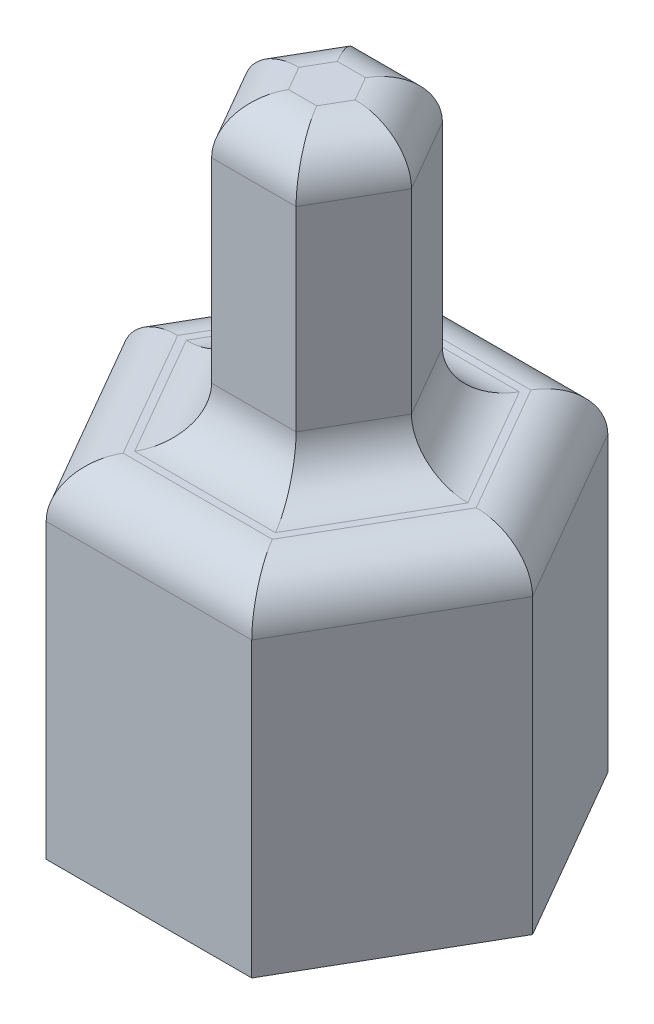
ISO-10303-21;
HEADER;
FILE_DESCRIPTION(('STEP AP214'),'2;1');
FILE_NAME('part.step','',(''),(''),'','','');
FILE_SCHEMA(('AUTOMOTIVE_DESIGN { 1 0 10303 214 1 1 1 1 }'));
ENDSEC;
DATA;
#1=APPLICATION_CONTEXT('core data for automotive mechanical design processes');
#2=APPLICATION_PROTOCOL_DEFINITION('international standard','automotive_design',2000,#1);
#3=PRODUCT_CONTEXT('',#1,'mechanical');
#4=PRODUCT('Part','Part','',(#3));
#5=PRODUCT_RELATED_PRODUCT_CATEGORY('part','',(#4));
#6=PRODUCT_DEFINITION_FORMATION('','',#4);
#7=PRODUCT_DEFINITION_CONTEXT('part definition',#1,'design');
#8=PRODUCT_DEFINITION('design','',#6,#7);
#9=PRODUCT_DEFINITION_SHAPE('','',#8);
#10=(LENGTH_UNIT() NAMED_UNIT(*) SI_UNIT(.MILLI.,.METRE.));
#11=(NAMED_UNIT(*) PLANE_ANGLE_UNIT() SI_UNIT($,.RADIAN.));
#12=(NAMED_UNIT(*) SI_UNIT($,.STERADIAN.) SOLID_ANGLE_UNIT());
#13=UNCERTAINTY_MEASURE_WITH_UNIT(LENGTH_MEASURE(1.E-05),#10,'distance_accuracy_value','');
#14=(GEOMETRIC_REPRESENTATION_CONTEXT(3) GLOBAL_UNCERTAINTY_ASSIGNED_CONTEXT((#13)) GLOBAL_UNIT_ASSIGNED_CONTEXT((#10,
#11,#12)) REPRESENTATION_CONTEXT('',''));
#15=CARTESIAN_POINT('',(0.,0.,0.));
#16=DIRECTION('',(0.,0.,1.));
#17=DIRECTION('',(1.,0.,0.));
#18=AXIS2_PLACEMENT_3D('',#15,#16,#17);
#19=CARTESIAN_POINT('',(0.,0.,0.));
#20=DIRECTION('',(0.,1.,0.));
#21=DIRECTION('',(0.,0.,1.));
#22=AXIS2_PLACEMENT_3D('',#19,#20,#21);
#23=PLANE('',#22);
#24=DIRECTION('',(0.5,0.,-0.866025403784439));
#25=VECTOR('',#24,1.);
#26=CARTESIAN_POINT('',(5.35261434565702,0.,9.271));
#27=LINE('',#26,#25);
#28=CARTESIAN_POINT('',(5.35261434565702,0.,9.271));
#29=VERTEX_POINT('',#28);
#30=CARTESIAN_POINT('',(10.705228691314,0.,0.));
#31=VERTEX_POINT('',#30);
#32=EDGE_CURVE('E249',#29,#31,#27,.T.);
#33=ORIENTED_EDGE('',*,*,#32,.F.);
#34=DIRECTION('',(1.,0.,0.));
#35=VECTOR('',#34,1.);
#36=CARTESIAN_POINT('',(-5.35261434565702,0.,9.271));
#37=LINE('',#36,#35);
#38=CARTESIAN_POINT('',(-5.35261434565702,0.,9.271));
#39=VERTEX_POINT('',#38);
#40=EDGE_CURVE('E264',#39,#29,#37,.T.);
#41=ORIENTED_EDGE('',*,*,#40,.F.);
#42=DIRECTION('',(0.5,0.,0.866025403784438));
#43=VECTOR('',#42,1.);
#44=CARTESIAN_POINT('',(-10.705228691314,0.,0.));
#45=LINE('',#44,#43);
#46=CARTESIAN_POINT('',(-10.705228691314,0.,0.));
#47=VERTEX_POINT('',#46);
#48=EDGE_CURVE('E261',#47,#39,#45,.T.);
#49=ORIENTED_EDGE('',*,*,#48,.F.);
#50=DIRECTION('',(-0.5,0.,0.866025403784439));
#51=VECTOR('',#50,1.);
#52=CARTESIAN_POINT('',(-5.35261434565702,0.,-9.271));
#53=LINE('',#52,#51);
#54=CARTESIAN_POINT('',(-5.35261434565702,0.,-9.271));
#55=VERTEX_POINT('',#54);
#56=EDGE_CURVE('E258',#55,#47,#53,.T.);
#57=ORIENTED_EDGE('',*,*,#56,.F.);
#58=DIRECTION('',(-1.,0.,0.));
#59=VECTOR('',#58,1.);
#60=CARTESIAN_POINT('',(5.35261434565702,0.,-9.271));
#61=LINE('',#60,#59);
#62=CARTESIAN_POINT('',(5.35261434565702,0.,-9.271));
#63=VERTEX_POINT('',#62);
#64=EDGE_CURVE('E255',#63,#55,#61,.T.);
#65=ORIENTED_EDGE('',*,*,#64,.F.);
#66=DIRECTION('',(-0.5,0.,-0.866025403784438));
#67=VECTOR('',#66,1.);
#68=CARTESIAN_POINT('',(10.705228691314,0.,0.));
#69=LINE('',#68,#67);
#70=EDGE_CURVE('E252',#31,#63,#69,.T.);
#71=ORIENTED_EDGE('',*,*,#70,.F.);
#72=EDGE_LOOP('',(#33,#41,#49,#57,#65,#71));
#73=FACE_BOUND('',#72,.T.);
#74=DIRECTION('',(-1.,0.,0.));
#75=VECTOR('',#74,1.);
#76=CARTESIAN_POINT('',(3.88614466191537,0.,-6.731));
#77=LINE('',#76,#75);
#78=CARTESIAN_POINT('',(3.88614466191537,0.,-6.731));
#79=VERTEX_POINT('',#78);
#80=CARTESIAN_POINT('',(-3.88614466191537,0.,-6.731));
#81=VERTEX_POINT('',#80);
#82=EDGE_CURVE('E633',#79,#81,#77,.T.);
#83=ORIENTED_EDGE('',*,*,#82,.T.);
#84=CARTESIAN_POINT('',(-7.77228932383074,0.,0.));
#85=CARTESIAN_POINT('',(-7.58898061336304,0.,-4.3815));
#86=CARTESIAN_POINT('',(-3.88614466191537,0.,-6.731));
#87=B_SPLINE_CURVE_WITH_KNOTS('',2,(#84,#85,#86),.UNSPECIFIED.,.F.,.F.,(3,3),(0.,1.),.UNSPECIFIED.);
#88=CARTESIAN_POINT('',(-7.77228932383074,0.,0.));
#89=VERTEX_POINT('',#88);
#90=EDGE_CURVE('E222',#89,#81,#87,.T.);
#91=ORIENTED_EDGE('',*,*,#90,.F.);
#92=DIRECTION('',(0.5,0.,0.866025403784438));
#93=VECTOR('',#92,1.);
#94=CARTESIAN_POINT('',(-7.77228932383074,0.,0.));
#95=LINE('',#94,#93);
#96=CARTESIAN_POINT('',(-3.88614466191537,0.,6.731));
#97=VERTEX_POINT('',#96);
#98=EDGE_CURVE('E237',#89,#97,#95,.T.);
#99=ORIENTED_EDGE('',*,*,#98,.T.);
#100=DIRECTION('',(1.,0.,0.));
#101=VECTOR('',#100,1.);
#102=CARTESIAN_POINT('',(-3.88614466191537,0.,6.731));
#103=LINE('',#102,#101);
#104=CARTESIAN_POINT('',(3.88614466191537,0.,6.731));
#105=VERTEX_POINT('',#104);
#106=EDGE_CURVE('E628',#97,#105,#103,.T.);
#107=ORIENTED_EDGE('',*,*,#106,.T.);
#108=CARTESIAN_POINT('',(7.77228932383074,0.,0.));
#109=CARTESIAN_POINT('',(7.58898061336304,0.,4.3815));
#110=CARTESIAN_POINT('',(3.88614466191537,0.,6.731));
#111=B_SPLINE_CURVE_WITH_KNOTS('',2,(#108,#109,#110),.UNSPECIFIED.,.F.,.F.,(3,3),(0.,1.),.UNSPECIFIED.);
#112=CARTESIAN_POINT('',(7.77228932383074,0.,0.));
#113=VERTEX_POINT('',#112);
#114=EDGE_CURVE('E349',#113,#105,#111,.T.);
#115=ORIENTED_EDGE('',*,*,#114,.F.);
#116=DIRECTION('',(-0.5,0.,-0.866025403784438));
#117=VECTOR('',#116,1.);
#118=CARTESIAN_POINT('',(7.77228932383074,0.,0.));
#119=LINE('',#118,#117);
#120=EDGE_CURVE('E624',#113,#79,#119,.T.);
#121=ORIENTED_EDGE('',*,*,#120,.T.);
#122=EDGE_LOOP('',(#83,#91,#99,#107,#115,#121));
#123=FACE_BOUND('',#122,.T.);
#124=ADVANCED_FACE('F32',(#73,#123),#23,.F.);
#125=CARTESIAN_POINT('',(5.35261434565702,15.24,9.271));
#126=DIRECTION('',(-0.866025403784439,0.,-0.5));
#127=DIRECTION('',(-0.5,0.,0.866025403784439));
#128=AXIS2_PLACEMENT_3D('',#125,#126,#127);
#129=PLANE('',#128);
#130=DIRECTION('',(0.,-1.,0.));
#131=VECTOR('',#130,1.);
#132=CARTESIAN_POINT('',(10.705228691314,15.24,0.));
#133=LINE('',#132,#131);
#134=CARTESIAN_POINT('',(10.705228691314,15.24,0.));
#135=VERTEX_POINT('',#134);
#136=EDGE_CURVE('E277',#135,#31,#133,.T.);
#137=ORIENTED_EDGE('',*,*,#136,.F.);
#138=DIRECTION('',(0.5,0.,-0.866025403784439));
#139=VECTOR('',#138,1.);
#140=CARTESIAN_POINT('',(5.35261434565702,15.24,9.271));
#141=LINE('',#140,#139);
#142=CARTESIAN_POINT('',(5.35261434565702,15.24,9.271));
#143=VERTEX_POINT('',#142);
#144=EDGE_CURVE('E11',#135,#143,#141,.F.);
#145=ORIENTED_EDGE('',*,*,#144,.T.);
#146=DIRECTION('',(0.,-1.,0.));
#147=VECTOR('',#146,1.);
#148=CARTESIAN_POINT('',(5.35261434565702,15.24,9.271));
#149=LINE('',#148,#147);
#150=EDGE_CURVE('E267',#143,#29,#149,.T.);
#151=ORIENTED_EDGE('',*,*,#150,.T.);
#152=ORIENTED_EDGE('',*,*,#32,.T.);
#153=EDGE_LOOP('',(#137,#145,#151,#152));
#154=FACE_BOUND('',#153,.T.);
#155=ADVANCED_FACE('F484',(#154),#129,.F.);
#156=CARTESIAN_POINT('',(10.705228691314,15.24,0.));
#157=DIRECTION('',(-0.866025403784438,0.,0.5));
#158=DIRECTION('',(0.5,0.,0.866025403784438));
#159=AXIS2_PLACEMENT_3D('',#156,#157,#158);
#160=PLANE('',#159);
#161=DIRECTION('',(0.,-1.,0.));
#162=VECTOR('',#161,1.);
#163=CARTESIAN_POINT('',(5.35261434565702,15.24,-9.271));
#164=LINE('',#163,#162);
#165=CARTESIAN_POINT('',(5.35261434565702,15.24,-9.271));
#166=VERTEX_POINT('',#165);
#167=EDGE_CURVE('E275',#166,#63,#164,.T.);
#168=ORIENTED_EDGE('',*,*,#167,.F.);
#169=DIRECTION('',(-0.5,0.,-0.866025403784438));
#170=VECTOR('',#169,1.);
#171=CARTESIAN_POINT('',(10.705228691314,15.24,0.));
#172=LINE('',#171,#170);
#173=EDGE_CURVE('E41',#166,#135,#172,.F.);
#174=ORIENTED_EDGE('',*,*,#173,.T.);
#175=ORIENTED_EDGE('',*,*,#136,.T.);
#176=ORIENTED_EDGE('',*,*,#70,.T.);
#177=EDGE_LOOP('',(#168,#174,#175,#176));
#178=FACE_BOUND('',#177,.T.);
#179=ADVANCED_FACE('F500',(#178),#160,.F.);
#180=CARTESIAN_POINT('',(5.35261434565702,15.24,-9.271));
#181=DIRECTION('',(0.,0.,1.));
#182=DIRECTION('',(1.,0.,0.));
#183=AXIS2_PLACEMENT_3D('',#180,#181,#182);
#184=PLANE('',#183);
#185=DIRECTION('',(0.,-1.,0.));
#186=VECTOR('',#185,1.);
#187=CARTESIAN_POINT('',(-5.35261434565702,15.24,-9.271));
#188=LINE('',#187,#186);
#189=CARTESIAN_POINT('',(-5.35261434565702,15.24,-9.271));
#190=VERTEX_POINT('',#189);
#191=EDGE_CURVE('E273',#190,#55,#188,.T.);
#192=ORIENTED_EDGE('',*,*,#191,.F.);
#193=DIRECTION('',(-1.,0.,0.));
#194=VECTOR('',#193,1.);
#195=CARTESIAN_POINT('',(5.35261434565702,15.24,-9.271));
#196=LINE('',#195,#194);
#197=EDGE_CURVE('E56',#190,#166,#196,.F.);
#198=ORIENTED_EDGE('',*,*,#197,.T.);
#199=ORIENTED_EDGE('',*,*,#167,.T.);
#200=ORIENTED_EDGE('',*,*,#64,.T.);
#201=EDGE_LOOP('',(#192,#198,#199,#200));
#202=FACE_BOUND('',#201,.T.);
#203=ADVANCED_FACE('F496',(#202),#184,.F.);
#204=CARTESIAN_POINT('',(-5.35261434565702,15.24,-9.271));
#205=DIRECTION('',(0.866025403784439,0.,0.5));
#206=DIRECTION('',(0.5,0.,-0.866025403784439));
#207=AXIS2_PLACEMENT_3D('',#204,#205,#206);
#208=PLANE('',#207);
#209=DIRECTION('',(0.,-1.,0.));
#210=VECTOR('',#209,1.);
#211=CARTESIAN_POINT('',(-10.705228691314,15.24,0.));
#212=LINE('',#211,#210);
#213=CARTESIAN_POINT('',(-10.705228691314,15.24,0.));
#214=VERTEX_POINT('',#213);
#215=EDGE_CURVE('E271',#214,#47,#212,.T.);
#216=ORIENTED_EDGE('',*,*,#215,.F.);
#217=DIRECTION('',(-0.5,0.,0.866025403784439));
#218=VECTOR('',#217,1.);
#219=CARTESIAN_POINT('',(-5.35261434565702,15.24,-9.271));
#220=LINE('',#219,#218);
#221=EDGE_CURVE('E381',#214,#190,#220,.F.);
#222=ORIENTED_EDGE('',*,*,#221,.T.);
#223=ORIENTED_EDGE('',*,*,#191,.T.);
#224=ORIENTED_EDGE('',*,*,#56,.T.);
#225=EDGE_LOOP('',(#216,#222,#223,#224));
#226=FACE_BOUND('',#225,.T.);
#227=ADVANCED_FACE('F492',(#226),#208,.F.);
#228=CARTESIAN_POINT('',(-10.705228691314,15.24,0.));
#229=DIRECTION('',(0.866025403784438,0.,-0.5));
#230=DIRECTION('',(-0.5,0.,-0.866025403784439));
#231=AXIS2_PLACEMENT_3D('',#228,#229,#230);
#232=PLANE('',#231);
#233=DIRECTION('',(0.,-1.,0.));
#234=VECTOR('',#233,1.);
#235=CARTESIAN_POINT('',(-5.35261434565702,15.24,9.271));
#236=LINE('',#235,#234);
#237=CARTESIAN_POINT('',(-5.35261434565702,15.24,9.271));
#238=VERTEX_POINT('',#237);
#239=EDGE_CURVE('E269',#238,#39,#236,.T.);
#240=ORIENTED_EDGE('',*,*,#239,.F.);
#241=DIRECTION('',(0.5,0.,0.866025403784439));
#242=VECTOR('',#241,1.);
#243=CARTESIAN_POINT('',(-10.705228691314,15.24,0.));
#244=LINE('',#243,#242);
#245=EDGE_CURVE('E379',#238,#214,#244,.F.);
#246=ORIENTED_EDGE('',*,*,#245,.T.);
#247=ORIENTED_EDGE('',*,*,#215,.T.);
#248=ORIENTED_EDGE('',*,*,#48,.T.);
#249=EDGE_LOOP('',(#240,#246,#247,#248));
#250=FACE_BOUND('',#249,.T.);
#251=ADVANCED_FACE('F488',(#250),#232,.F.);
#252=CARTESIAN_POINT('',(-5.35261434565702,15.24,9.271));
#253=DIRECTION('',(0.,0.,-1.));
#254=DIRECTION('',(-1.,0.,0.));
#255=AXIS2_PLACEMENT_3D('',#252,#253,#254);
#256=PLANE('',#255);
#257=ORIENTED_EDGE('',*,*,#150,.F.);
#258=DIRECTION('',(1.,0.,0.));
#259=VECTOR('',#258,1.);
#260=CARTESIAN_POINT('',(-5.35261434565702,15.24,9.271));
#261=LINE('',#260,#259);
#262=EDGE_CURVE('E376',#143,#238,#261,.F.);
#263=ORIENTED_EDGE('',*,*,#262,.T.);
#264=ORIENTED_EDGE('',*,*,#239,.T.);
#265=ORIENTED_EDGE('',*,*,#40,.T.);
#266=EDGE_LOOP('',(#257,#263,#264,#265));
#267=FACE_BOUND('',#266,.T.);
#268=ADVANCED_FACE('F480',(#267),#256,.F.);
#269=CARTESIAN_POINT('',(7.77228932383074,15.24,0.));
#270=DIRECTION('',(-0.866025403784438,0.,0.5));
#271=DIRECTION('',(0.5,0.,0.866025403784438));
#272=AXIS2_PLACEMENT_3D('',#269,#270,#271);
#273=PLANE('',#272);
#274=ORIENTED_EDGE('',*,*,#120,.F.);
#275=DIRECTION('',(0.,-1.,0.));
#276=VECTOR('',#275,1.);
#277=CARTESIAN_POINT('',(7.77228932383074,15.24,0.));
#278=LINE('',#277,#276);
#279=CARTESIAN_POINT('',(7.77228932383074,15.24,0.));
#280=VERTEX_POINT('',#279);
#281=EDGE_CURVE('E247',#280,#113,#278,.T.);
#282=ORIENTED_EDGE('',*,*,#281,.F.);
#283=DIRECTION('',(-0.5,0.,-0.866025403784438));
#284=VECTOR('',#283,1.);
#285=CARTESIAN_POINT('',(7.77228932383074,15.24,0.));
#286=LINE('',#285,#284);
#287=CARTESIAN_POINT('',(3.88614466191537,15.24,-6.731));
#288=VERTEX_POINT('',#287);
#289=EDGE_CURVE('E625',#280,#288,#286,.T.);
#290=ORIENTED_EDGE('',*,*,#289,.T.);
#291=DIRECTION('',(0.,-1.,0.));
#292=VECTOR('',#291,1.);
#293=CARTESIAN_POINT('',(3.88614466191537,15.24,-6.731));
#294=LINE('',#293,#292);
#295=EDGE_CURVE('E240',#288,#79,#294,.T.);
#296=ORIENTED_EDGE('',*,*,#295,.T.);
#297=EDGE_LOOP('',(#274,#282,#290,#296));
#298=FACE_BOUND('',#297,.T.);
#299=ADVANCED_FACE('F476',(#298),#273,.T.);
#300=CARTESIAN_POINT('',(3.88614466191537,15.24,-6.731));
#301=DIRECTION('',(0.,0.,1.));
#302=DIRECTION('',(1.,0.,0.));
#303=AXIS2_PLACEMENT_3D('',#300,#301,#302);
#304=PLANE('',#303);
#305=ORIENTED_EDGE('',*,*,#82,.F.);
#306=ORIENTED_EDGE('',*,*,#295,.F.);
#307=DIRECTION('',(-1.,0.,0.));
#308=VECTOR('',#307,1.);
#309=CARTESIAN_POINT('',(3.88614466191537,15.24,-6.731));
#310=LINE('',#309,#308);
#311=CARTESIAN_POINT('',(-3.88614466191537,15.24,-6.731));
#312=VERTEX_POINT('',#311);
#313=EDGE_CURVE('E232',#288,#312,#310,.T.);
#314=ORIENTED_EDGE('',*,*,#313,.T.);
#315=DIRECTION('',(0.,-1.,0.));
#316=VECTOR('',#315,1.);
#317=CARTESIAN_POINT('',(-3.88614466191537,15.24,-6.731));
#318=LINE('',#317,#316);
#319=EDGE_CURVE('E218',#312,#81,#318,.T.);
#320=ORIENTED_EDGE('',*,*,#319,.T.);
#321=EDGE_LOOP('',(#305,#306,#314,#320));
#322=FACE_BOUND('',#321,.T.);
#323=ADVANCED_FACE('F473',(#322),#304,.T.);
#324=CARTESIAN_POINT('',(-7.77228932383074,15.24,0.));
#325=DIRECTION('',(0.866025403784438,0.,-0.5));
#326=DIRECTION('',(-0.5,0.,-0.866025403784438));
#327=AXIS2_PLACEMENT_3D('',#324,#325,#326);
#328=PLANE('',#327);
#329=ORIENTED_EDGE('',*,*,#98,.F.);
#330=DIRECTION('',(0.,-1.,0.));
#331=VECTOR('',#330,1.);
#332=CARTESIAN_POINT('',(-7.77228932383074,15.24,0.));
#333=LINE('',#332,#331);
#334=CARTESIAN_POINT('',(-7.77228932383074,15.24,0.));
#335=VERTEX_POINT('',#334);
#336=EDGE_CURVE('E215',#335,#89,#333,.T.);
#337=ORIENTED_EDGE('',*,*,#336,.F.);
#338=DIRECTION('',(0.5,0.,0.866025403784438));
#339=VECTOR('',#338,1.);
#340=CARTESIAN_POINT('',(-7.77228932383074,15.24,0.));
#341=LINE('',#340,#339);
#342=CARTESIAN_POINT('',(-3.88614466191537,15.24,6.731));
#343=VERTEX_POINT('',#342);
#344=EDGE_CURVE('E225',#335,#343,#341,.T.);
#345=ORIENTED_EDGE('',*,*,#344,.T.);
#346=DIRECTION('',(0.,-1.,0.));
#347=VECTOR('',#346,1.);
#348=CARTESIAN_POINT('',(-3.88614466191537,15.24,6.731));
#349=LINE('',#348,#347);
#350=EDGE_CURVE('E238',#343,#97,#349,.T.);
#351=ORIENTED_EDGE('',*,*,#350,.T.);
#352=EDGE_LOOP('',(#329,#337,#345,#351));
#353=FACE_BOUND('',#352,.T.);
#354=ADVANCED_FACE('F235',(#353),#328,.T.);
#355=CARTESIAN_POINT('',(-3.88614466191537,15.24,6.731));
#356=DIRECTION('',(0.,0.,-1.));
#357=DIRECTION('',(-1.,0.,0.));
#358=AXIS2_PLACEMENT_3D('',#355,#356,#357);
#359=PLANE('',#358);
#360=ORIENTED_EDGE('',*,*,#106,.F.);
#361=ORIENTED_EDGE('',*,*,#350,.F.);
#362=DIRECTION('',(1.,0.,0.));
#363=VECTOR('',#362,1.);
#364=CARTESIAN_POINT('',(-3.88614466191537,15.24,6.731));
#365=LINE('',#364,#363);
#366=CARTESIAN_POINT('',(3.88614466191537,15.24,6.731));
#367=VERTEX_POINT('',#366);
#368=EDGE_CURVE('E229',#343,#367,#365,.T.);
#369=ORIENTED_EDGE('',*,*,#368,.T.);
#370=DIRECTION('',(0.,-1.,0.));
#371=VECTOR('',#370,1.);
#372=CARTESIAN_POINT('',(3.88614466191537,15.24,6.731));
#373=LINE('',#372,#371);
#374=EDGE_CURVE('E242',#367,#105,#373,.T.);
#375=ORIENTED_EDGE('',*,*,#374,.T.);
#376=EDGE_LOOP('',(#360,#361,#369,#375));
#377=FACE_BOUND('',#376,.T.);
#378=ADVANCED_FACE('F467',(#377),#359,.T.);
#379=CARTESIAN_POINT('',(0.,15.24,0.));
#380=DIRECTION('',(0.,1.,0.));
#381=DIRECTION('',(0.,0.,1.));
#382=AXIS2_PLACEMENT_3D('',#379,#380,#381);
#383=PLANE('',#382);
#384=ORIENTED_EDGE('',*,*,#289,.F.);
#385=CARTESIAN_POINT('',(7.77228932383074,15.24,0.));
#386=CARTESIAN_POINT('',(7.58898061336304,15.24,4.3815));
#387=CARTESIAN_POINT('',(3.88614466191537,15.24,6.731));
#388=B_SPLINE_CURVE_WITH_KNOTS('',2,(#385,#386,#387),.UNSPECIFIED.,.F.,.F.,(3,3),(0.,1.),.UNSPECIFIED.);
#389=EDGE_CURVE('E411',#280,#367,#388,.T.);
#390=ORIENTED_EDGE('',*,*,#389,.T.);
#391=ORIENTED_EDGE('',*,*,#368,.F.);
#392=ORIENTED_EDGE('',*,*,#344,.F.);
#393=CARTESIAN_POINT('',(-7.77228932383074,15.24,0.));
#394=CARTESIAN_POINT('',(-7.58898061336304,15.24,-4.3815));
#395=CARTESIAN_POINT('',(-3.88614466191537,15.24,-6.731));
#396=B_SPLINE_CURVE_WITH_KNOTS('',2,(#393,#394,#395),.UNSPECIFIED.,.F.,.F.,(3,3),(0.,1.),.UNSPECIFIED.);
#397=EDGE_CURVE('E211',#335,#312,#396,.T.);
#398=ORIENTED_EDGE('',*,*,#397,.T.);
#399=ORIENTED_EDGE('',*,*,#313,.F.);
#400=EDGE_LOOP('',(#384,#390,#391,#392,#398,#399));
#401=FACE_BOUND('',#400,.T.);
#402=ADVANCED_FACE('F227',(#401),#383,.F.);
#403=CARTESIAN_POINT('',(0.,17.78,0.));
#404=DIRECTION('',(0.,1.,0.));
#405=DIRECTION('',(0.,0.,1.));
#406=AXIS2_PLACEMENT_3D('',#403,#404,#405);
#407=PLANE('',#406);
#408=DIRECTION('',(0.5,0.,0.866025403784439));
#409=VECTOR('',#408,1.);
#410=CARTESIAN_POINT('',(-3.15290982004454,17.78,8.001));
#411=LINE('',#410,#409);
#412=CARTESIAN_POINT('',(-7.77228932383074,17.78,0.));
#413=VERTEX_POINT('',#412);
#414=CARTESIAN_POINT('',(-3.88614466191537,17.78,6.731));
#415=VERTEX_POINT('',#414);
#416=EDGE_CURVE('E371',#413,#415,#411,.T.);
#417=ORIENTED_EDGE('',*,*,#416,.T.);
#418=DIRECTION('',(1.,0.,0.));
#419=VECTOR('',#418,1.);
#420=CARTESIAN_POINT('',(5.35261434565702,17.78,6.731));
#421=LINE('',#420,#419);
#422=CARTESIAN_POINT('',(3.88614466191537,17.78,6.731));
#423=VERTEX_POINT('',#422);
#424=EDGE_CURVE('E373',#415,#423,#421,.T.);
#425=ORIENTED_EDGE('',*,*,#424,.T.);
#426=DIRECTION('',(0.5,0.,-0.866025403784439));
#427=VECTOR('',#426,1.);
#428=CARTESIAN_POINT('',(8.50552416570157,17.78,-1.27));
#429=LINE('',#428,#427);
#430=CARTESIAN_POINT('',(7.77228932383074,17.78,0.));
#431=VERTEX_POINT('',#430);
#432=EDGE_CURVE('E331',#423,#431,#429,.T.);
#433=ORIENTED_EDGE('',*,*,#432,.T.);
#434=DIRECTION('',(-0.5,0.,-0.866025403784438));
#435=VECTOR('',#434,1.);
#436=CARTESIAN_POINT('',(3.15290982004454,17.78,-8.001));
#437=LINE('',#436,#435);
#438=CARTESIAN_POINT('',(3.88614466191537,17.78,-6.731));
#439=VERTEX_POINT('',#438);
#440=EDGE_CURVE('E365',#431,#439,#437,.T.);
#441=ORIENTED_EDGE('',*,*,#440,.T.);
#442=DIRECTION('',(-1.,0.,0.));
#443=VECTOR('',#442,1.);
#444=CARTESIAN_POINT('',(-5.35261434565702,17.78,-6.731));
#445=LINE('',#444,#443);
#446=CARTESIAN_POINT('',(-3.88614466191537,17.78,-6.731));
#447=VERTEX_POINT('',#446);
#448=EDGE_CURVE('E367',#439,#447,#445,.T.);
#449=ORIENTED_EDGE('',*,*,#448,.T.);
#450=DIRECTION('',(-0.5,0.,0.866025403784439));
#451=VECTOR('',#450,1.);
#452=CARTESIAN_POINT('',(-8.50552416570156,17.78,1.27));
#453=LINE('',#452,#451);
#454=EDGE_CURVE('E369',#447,#413,#453,.T.);
#455=ORIENTED_EDGE('',*,*,#454,.T.);
#456=EDGE_LOOP('',(#417,#425,#433,#441,#449,#455));
#457=FACE_BOUND('',#456,.T.);
#458=DIRECTION('',(-0.5,0.,0.866025403784439));
#459=VECTOR('',#458,1.);
#460=CARTESIAN_POINT('',(-5.49926131403118,17.78,-3.175));
#461=LINE('',#460,#459);
#462=CARTESIAN_POINT('',(-7.33234841870825,17.78,0.));
#463=VERTEX_POINT('',#462);
#464=CARTESIAN_POINT('',(-3.66617420935412,17.78,-6.35));
#465=VERTEX_POINT('',#464);
#466=EDGE_CURVE('E326',#463,#465,#461,.F.);
#467=ORIENTED_EDGE('',*,*,#466,.T.);
#468=DIRECTION('',(-1.,0.,0.));
#469=VECTOR('',#468,1.);
#470=CARTESIAN_POINT('',(0.,17.78,-6.35));
#471=LINE('',#470,#469);
#472=CARTESIAN_POINT('',(3.66617420935412,17.78,-6.35));
#473=VERTEX_POINT('',#472);
#474=EDGE_CURVE('E328',#465,#473,#471,.F.);
#475=ORIENTED_EDGE('',*,*,#474,.T.);
#476=DIRECTION('',(-0.5,0.,-0.866025403784438));
#477=VECTOR('',#476,1.);
#478=CARTESIAN_POINT('',(5.49926131403118,17.78,-3.175));
#479=LINE('',#478,#477);
#480=CARTESIAN_POINT('',(7.33234841870825,17.78,0.));
#481=VERTEX_POINT('',#480);
#482=EDGE_CURVE('E318',#473,#481,#479,.F.);
#483=ORIENTED_EDGE('',*,*,#482,.T.);
#484=DIRECTION('',(0.5,0.,-0.866025403784439));
#485=VECTOR('',#484,1.);
#486=CARTESIAN_POINT('',(5.49926131403119,17.78,3.175));
#487=LINE('',#486,#485);
#488=CARTESIAN_POINT('',(3.66617420935412,17.78,6.35));
#489=VERTEX_POINT('',#488);
#490=EDGE_CURVE('E320',#481,#489,#487,.F.);
#491=ORIENTED_EDGE('',*,*,#490,.T.);
#492=DIRECTION('',(1.,0.,0.));
#493=VECTOR('',#492,1.);
#494=CARTESIAN_POINT('',(0.,17.78,6.35));
#495=LINE('',#494,#493);
#496=CARTESIAN_POINT('',(-3.66617420935412,17.78,6.35));
#497=VERTEX_POINT('',#496);
#498=EDGE_CURVE('E322',#489,#497,#495,.F.);
#499=ORIENTED_EDGE('',*,*,#498,.T.);
#500=DIRECTION('',(0.5,0.,0.866025403784439));
#501=VECTOR('',#500,1.);
#502=CARTESIAN_POINT('',(-5.49926131403118,17.78,3.175));
#503=LINE('',#502,#501);
#504=EDGE_CURVE('E324',#497,#463,#503,.F.);
#505=ORIENTED_EDGE('',*,*,#504,.T.);
#506=EDGE_LOOP('',(#467,#475,#483,#491,#499,#505));
#507=FACE_BOUND('',#506,.T.);
#508=ADVANCED_FACE('F460',(#457,#507),#407,.T.);
#509=CARTESIAN_POINT('',(2.19970452561247,33.02,3.81));
#510=DIRECTION('',(-0.866025403784439,0.,-0.5));
#511=DIRECTION('',(-0.5,0.,0.866025403784439));
#512=AXIS2_PLACEMENT_3D('',#509,#510,#511);
#513=PLANE('',#512);
#514=DIRECTION('',(0.,-1.,0.));
#515=VECTOR('',#514,1.);
#516=CARTESIAN_POINT('',(4.39940905122495,33.02,0.));
#517=LINE('',#516,#515);
#518=CARTESIAN_POINT('',(4.39940905122495,30.48,0.));
#519=VERTEX_POINT('',#518);
#520=CARTESIAN_POINT('',(4.39940905122495,20.32,0.));
#521=VERTEX_POINT('',#520);
#522=EDGE_CURVE('E616',#519,#521,#517,.T.);
#523=ORIENTED_EDGE('',*,*,#522,.F.);
#524=DIRECTION('',(0.5,0.,-0.866025403784439));
#525=VECTOR('',#524,1.);
#526=CARTESIAN_POINT('',(2.19970452561247,30.48,3.81));
#527=LINE('',#526,#525);
#528=CARTESIAN_POINT('',(2.19970452561247,30.48,3.81));
#529=VERTEX_POINT('',#528);
#530=EDGE_CURVE('E316',#519,#529,#527,.F.);
#531=ORIENTED_EDGE('',*,*,#530,.T.);
#532=DIRECTION('',(0.,-1.,0.));
#533=VECTOR('',#532,1.);
#534=CARTESIAN_POINT('',(2.19970452561247,33.02,3.81));
#535=LINE('',#534,#533);
#536=CARTESIAN_POINT('',(2.19970452561247,20.32,3.81));
#537=VERTEX_POINT('',#536);
#538=EDGE_CURVE('E419',#529,#537,#535,.T.);
#539=ORIENTED_EDGE('',*,*,#538,.T.);
#540=DIRECTION('',(0.5,0.,-0.866025403784439));
#541=VECTOR('',#540,1.);
#542=CARTESIAN_POINT('',(2.19970452561247,20.32,3.81));
#543=LINE('',#542,#541);
#544=EDGE_CURVE('E314',#537,#521,#543,.T.);
#545=ORIENTED_EDGE('',*,*,#544,.T.);
#546=EDGE_LOOP('',(#523,#531,#539,#545));
#547=FACE_BOUND('',#546,.T.);
#548=ADVANCED_FACE('F456',(#547),#513,.F.);
#549=CARTESIAN_POINT('',(4.39940905122495,33.02,0.));
#550=DIRECTION('',(-0.866025403784438,0.,0.5));
#551=DIRECTION('',(0.5,0.,0.866025403784438));
#552=AXIS2_PLACEMENT_3D('',#549,#550,#551);
#553=PLANE('',#552);
#554=DIRECTION('',(0.,-1.,0.));
#555=VECTOR('',#554,1.);
#556=CARTESIAN_POINT('',(2.19970452561247,33.02,-3.81));
#557=LINE('',#556,#555);
#558=CARTESIAN_POINT('',(2.19970452561247,30.48,-3.81));
#559=VERTEX_POINT('',#558);
#560=CARTESIAN_POINT('',(2.19970452561247,20.32,-3.81));
#561=VERTEX_POINT('',#560);
#562=EDGE_CURVE('E612',#559,#561,#557,.T.);
#563=ORIENTED_EDGE('',*,*,#562,.F.);
#564=DIRECTION('',(-0.5,0.,-0.866025403784438));
#565=VECTOR('',#564,1.);
#566=CARTESIAN_POINT('',(4.39940905122495,30.48,0.));
#567=LINE('',#566,#565);
#568=EDGE_CURVE('E312',#559,#519,#567,.F.);
#569=ORIENTED_EDGE('',*,*,#568,.T.);
#570=ORIENTED_EDGE('',*,*,#522,.T.);
#571=DIRECTION('',(-0.5,0.,-0.866025403784438));
#572=VECTOR('',#571,1.);
#573=CARTESIAN_POINT('',(4.39940905122495,20.32,0.));
#574=LINE('',#573,#572);
#575=EDGE_CURVE('E310',#521,#561,#574,.T.);
#576=ORIENTED_EDGE('',*,*,#575,.T.);
#577=EDGE_LOOP('',(#563,#569,#570,#576));
#578=FACE_BOUND('',#577,.T.);
#579=ADVANCED_FACE('F452',(#578),#553,.F.);
#580=CARTESIAN_POINT('',(2.19970452561247,33.02,-3.81));
#581=DIRECTION('',(0.,0.,1.));
#582=DIRECTION('',(1.,0.,0.));
#583=AXIS2_PLACEMENT_3D('',#580,#581,#582);
#584=PLANE('',#583);
#585=DIRECTION('',(0.,-1.,0.));
#586=VECTOR('',#585,1.);
#587=CARTESIAN_POINT('',(-2.19970452561247,33.02,-3.81));
#588=LINE('',#587,#586);
#589=CARTESIAN_POINT('',(-2.19970452561247,30.48,-3.81));
#590=VERTEX_POINT('',#589);
#591=CARTESIAN_POINT('',(-2.19970452561247,20.32,-3.81));
#592=VERTEX_POINT('',#591);
#593=EDGE_CURVE('E609',#590,#592,#588,.T.);
#594=ORIENTED_EDGE('',*,*,#593,.F.);
#595=DIRECTION('',(-1.,0.,0.));
#596=VECTOR('',#595,1.);
#597=CARTESIAN_POINT('',(2.19970452561247,30.48,-3.81));
#598=LINE('',#597,#596);
#599=EDGE_CURVE('E308',#590,#559,#598,.F.);
#600=ORIENTED_EDGE('',*,*,#599,.T.);
#601=ORIENTED_EDGE('',*,*,#562,.T.);
#602=DIRECTION('',(-1.,0.,0.));
#603=VECTOR('',#602,1.);
#604=CARTESIAN_POINT('',(2.19970452561247,20.32,-3.81));
#605=LINE('',#604,#603);
#606=EDGE_CURVE('E305',#561,#592,#605,.T.);
#607=ORIENTED_EDGE('',*,*,#606,.T.);
#608=EDGE_LOOP('',(#594,#600,#601,#607));
#609=FACE_BOUND('',#608,.T.);
#610=ADVANCED_FACE('F448',(#609),#584,.F.);
#611=CARTESIAN_POINT('',(-2.19970452561247,33.02,-3.81));
#612=DIRECTION('',(0.866025403784439,0.,0.5));
#613=DIRECTION('',(0.5,0.,-0.866025403784439));
#614=AXIS2_PLACEMENT_3D('',#611,#612,#613);
#615=PLANE('',#614);
#616=DIRECTION('',(0.,-1.,0.));
#617=VECTOR('',#616,1.);
#618=CARTESIAN_POINT('',(-4.39940905122495,33.02,0.));
#619=LINE('',#618,#617);
#620=CARTESIAN_POINT('',(-4.39940905122495,30.48,0.));
#621=VERTEX_POINT('',#620);
#622=CARTESIAN_POINT('',(-4.39940905122495,20.32,0.));
#623=VERTEX_POINT('',#622);
#624=EDGE_CURVE('E614',#621,#623,#619,.T.);
#625=ORIENTED_EDGE('',*,*,#624,.F.);
#626=DIRECTION('',(-0.5,0.,0.866025403784439));
#627=VECTOR('',#626,1.);
#628=CARTESIAN_POINT('',(-2.19970452561247,30.48,-3.81));
#629=LINE('',#628,#627);
#630=EDGE_CURVE('E303',#621,#590,#629,.F.);
#631=ORIENTED_EDGE('',*,*,#630,.T.);
#632=ORIENTED_EDGE('',*,*,#593,.T.);
#633=DIRECTION('',(-0.5,0.,0.866025403784439));
#634=VECTOR('',#633,1.);
#635=CARTESIAN_POINT('',(-2.19970452561247,20.32,-3.81));
#636=LINE('',#635,#634);
#637=EDGE_CURVE('E301',#592,#623,#636,.T.);
#638=ORIENTED_EDGE('',*,*,#637,.T.);
#639=EDGE_LOOP('',(#625,#631,#632,#638));
#640=FACE_BOUND('',#639,.T.);
#641=ADVANCED_FACE('F444',(#640),#615,.F.);
#642=CARTESIAN_POINT('',(-4.39940905122495,33.02,0.));
#643=DIRECTION('',(0.866025403784438,0.,-0.5));
#644=DIRECTION('',(-0.5,0.,-0.866025403784439));
#645=AXIS2_PLACEMENT_3D('',#642,#643,#644);
#646=PLANE('',#645);
#647=DIRECTION('',(0.,-1.,0.));
#648=VECTOR('',#647,1.);
#649=CARTESIAN_POINT('',(-2.19970452561247,33.02,3.81));
#650=LINE('',#649,#648);
#651=CARTESIAN_POINT('',(-2.19970452561247,30.48,3.81));
#652=VERTEX_POINT('',#651);
#653=CARTESIAN_POINT('',(-2.19970452561247,20.32,3.81));
#654=VERTEX_POINT('',#653);
#655=EDGE_CURVE('E618',#652,#654,#650,.T.);
#656=ORIENTED_EDGE('',*,*,#655,.F.);
#657=DIRECTION('',(0.5,0.,0.866025403784439));
#658=VECTOR('',#657,1.);
#659=CARTESIAN_POINT('',(-4.39940905122495,30.48,0.));
#660=LINE('',#659,#658);
#661=EDGE_CURVE('E299',#652,#621,#660,.F.);
#662=ORIENTED_EDGE('',*,*,#661,.T.);
#663=ORIENTED_EDGE('',*,*,#624,.T.);
#664=DIRECTION('',(0.5,0.,0.866025403784439));
#665=VECTOR('',#664,1.);
#666=CARTESIAN_POINT('',(-4.39940905122495,20.32,0.));
#667=LINE('',#666,#665);
#668=EDGE_CURVE('E297',#623,#654,#667,.T.);
#669=ORIENTED_EDGE('',*,*,#668,.T.);
#670=EDGE_LOOP('',(#656,#662,#663,#669));
#671=FACE_BOUND('',#670,.T.);
#672=ADVANCED_FACE('F440',(#671),#646,.F.);
#673=CARTESIAN_POINT('',(-2.19970452561247,33.02,3.81));
#674=DIRECTION('',(0.,0.,-1.));
#675=DIRECTION('',(-1.,0.,0.));
#676=AXIS2_PLACEMENT_3D('',#673,#674,#675);
#677=PLANE('',#676);
#678=ORIENTED_EDGE('',*,*,#538,.F.);
#679=DIRECTION('',(1.,0.,0.));
#680=VECTOR('',#679,1.);
#681=CARTESIAN_POINT('',(-2.19970452561247,30.48,3.81));
#682=LINE('',#681,#680);
#683=EDGE_CURVE('E294',#529,#652,#682,.F.);
#684=ORIENTED_EDGE('',*,*,#683,.T.);
#685=ORIENTED_EDGE('',*,*,#655,.T.);
#686=DIRECTION('',(1.,0.,0.));
#687=VECTOR('',#686,1.);
#688=CARTESIAN_POINT('',(-2.19970452561247,20.32,3.81));
#689=LINE('',#688,#687);
#690=EDGE_CURVE('E292',#654,#537,#689,.T.);
#691=ORIENTED_EDGE('',*,*,#690,.T.);
#692=EDGE_LOOP('',(#678,#684,#685,#691));
#693=FACE_BOUND('',#692,.T.);
#694=ADVANCED_FACE('F436',(#693),#677,.F.);
#695=CARTESIAN_POINT('',(0.,33.02,0.));
#696=DIRECTION('',(0.,1.,0.));
#697=DIRECTION('',(0.,0.,1.));
#698=AXIS2_PLACEMENT_3D('',#695,#696,#697);
#699=PLANE('',#698);
#700=DIRECTION('',(0.5,0.,0.866025403784439));
#701=VECTOR('',#700,1.);
#702=CARTESIAN_POINT('',(0.,33.02,2.54));
#703=LINE('',#702,#701);
#704=CARTESIAN_POINT('',(-1.46646968374165,33.02,0.));
#705=VERTEX_POINT('',#704);
#706=CARTESIAN_POINT('',(-0.733234841870824,33.02,1.27));
#707=VERTEX_POINT('',#706);
#708=EDGE_CURVE('E287',#705,#707,#703,.T.);
#709=ORIENTED_EDGE('',*,*,#708,.T.);
#710=DIRECTION('',(1.,0.,0.));
#711=VECTOR('',#710,1.);
#712=CARTESIAN_POINT('',(2.19970452561247,33.02,1.27));
#713=LINE('',#712,#711);
#714=CARTESIAN_POINT('',(0.733234841870825,33.02,1.27));
#715=VERTEX_POINT('',#714);
#716=EDGE_CURVE('E289',#707,#715,#713,.T.);
#717=ORIENTED_EDGE('',*,*,#716,.T.);
#718=DIRECTION('',(0.5,0.,-0.866025403784439));
#719=VECTOR('',#718,1.);
#720=CARTESIAN_POINT('',(2.19970452561247,33.02,-1.27));
#721=LINE('',#720,#719);
#722=CARTESIAN_POINT('',(1.46646968374165,33.02,0.));
#723=VERTEX_POINT('',#722);
#724=EDGE_CURVE('E279',#715,#723,#721,.T.);
#725=ORIENTED_EDGE('',*,*,#724,.T.);
#726=DIRECTION('',(-0.5,0.,-0.866025403784438));
#727=VECTOR('',#726,1.);
#728=CARTESIAN_POINT('',(0.,33.02,-2.54));
#729=LINE('',#728,#727);
#730=CARTESIAN_POINT('',(0.733234841870822,33.02,-1.27));
#731=VERTEX_POINT('',#730);
#732=EDGE_CURVE('E281',#723,#731,#729,.T.);
#733=ORIENTED_EDGE('',*,*,#732,.T.);
#734=DIRECTION('',(-1.,0.,0.));
#735=VECTOR('',#734,1.);
#736=CARTESIAN_POINT('',(-2.19970452561247,33.02,-1.27));
#737=LINE('',#736,#735);
#738=CARTESIAN_POINT('',(-0.733234841870824,33.02,-1.27));
#739=VERTEX_POINT('',#738);
#740=EDGE_CURVE('E283',#731,#739,#737,.T.);
#741=ORIENTED_EDGE('',*,*,#740,.T.);
#742=DIRECTION('',(-0.5,0.,0.866025403784439));
#743=VECTOR('',#742,1.);
#744=CARTESIAN_POINT('',(-2.19970452561247,33.02,1.27));
#745=LINE('',#744,#743);
#746=EDGE_CURVE('E285',#739,#705,#745,.T.);
#747=ORIENTED_EDGE('',*,*,#746,.T.);
#748=EDGE_LOOP('',(#709,#717,#725,#733,#741,#747));
#749=FACE_BOUND('',#748,.T.);
#750=ADVANCED_FACE('F432',(#749),#699,.T.);
#751=DIRECTION('',(0.,-1.,0.));
#752=VECTOR('',#751,1.);
#753=SURFACE_OF_LINEAR_EXTRUSION('',#388,#752);
#754=ORIENTED_EDGE('',*,*,#114,.T.);
#755=ORIENTED_EDGE('',*,*,#374,.F.);
#756=ORIENTED_EDGE('',*,*,#389,.F.);
#757=ORIENTED_EDGE('',*,*,#281,.T.);
#758=EDGE_LOOP('',(#754,#755,#756,#757));
#759=FACE_BOUND('',#758,.T.);
#760=ADVANCED_FACE('F427',(#759),#753,.F.);
#761=CARTESIAN_POINT('',(0.,30.48,-1.27));
#762=DIRECTION('',(1.,0.,0.));
#763=DIRECTION('',(0.,0.,-1.));
#764=AXIS2_PLACEMENT_3D('',#761,#762,#763);
#765=CYLINDRICAL_SURFACE('',#764,2.54);
#766=CARTESIAN_POINT('',(0.733234841870822,30.48,-1.27));
#767=DIRECTION('',(0.866025403784439,0.,0.5));
#768=DIRECTION('',(-0.5,0.,0.866025403784439));
#769=AXIS2_PLACEMENT_3D('',#766,#767,#768);
#770=ELLIPSE('',#769,2.9329393674833,2.54);
#771=EDGE_CURVE('E343',#559,#731,#770,.T.);
#772=ORIENTED_EDGE('',*,*,#771,.F.);
#773=ORIENTED_EDGE('',*,*,#599,.F.);
#774=CARTESIAN_POINT('',(-0.733234841870824,30.48,-1.27));
#775=DIRECTION('',(0.866025403784439,0.,-0.5));
#776=DIRECTION('',(0.5,0.,0.866025403784439));
#777=AXIS2_PLACEMENT_3D('',#774,#775,#776);
#778=ELLIPSE('',#777,2.9329393674833,2.54);
#779=EDGE_CURVE('E346',#739,#590,#778,.F.);
#780=ORIENTED_EDGE('',*,*,#779,.F.);
#781=ORIENTED_EDGE('',*,*,#740,.F.);
#782=EDGE_LOOP('',(#772,#773,#780,#781));
#783=FACE_BOUND('',#782,.T.);
#784=ADVANCED_FACE('F431',(#783),#765,.T.);
#785=CARTESIAN_POINT('',(-1.09985226280624,30.48,-0.635));
#786=DIRECTION('',(0.5,0.,-0.866025403784439));
#787=DIRECTION('',(-0.866025403784439,0.,-0.5));
#788=AXIS2_PLACEMENT_3D('',#785,#786,#787);
#789=CYLINDRICAL_SURFACE('',#788,2.54);
#790=ORIENTED_EDGE('',*,*,#779,.T.);
#791=ORIENTED_EDGE('',*,*,#630,.F.);
#792=CARTESIAN_POINT('',(-1.46646968374165,30.48,0.));
#793=DIRECTION('',(0.,0.,-1.));
#794=DIRECTION('',(1.,0.,0.));
#795=AXIS2_PLACEMENT_3D('',#792,#793,#794);
#796=ELLIPSE('',#795,2.9329393674833,2.54);
#797=EDGE_CURVE('E340',#705,#621,#796,.F.);
#798=ORIENTED_EDGE('',*,*,#797,.F.);
#799=ORIENTED_EDGE('',*,*,#746,.F.);
#800=EDGE_LOOP('',(#790,#791,#798,#799));
#801=FACE_BOUND('',#800,.T.);
#802=ADVANCED_FACE('F522',(#801),#789,.T.);
#803=CARTESIAN_POINT('',(1.09985226280624,30.48,-0.635));
#804=DIRECTION('',(0.5,0.,0.866025403784438));
#805=DIRECTION('',(0.866025403784438,0.,-0.5));
#806=AXIS2_PLACEMENT_3D('',#803,#804,#805);
#807=CYLINDRICAL_SURFACE('',#806,2.54);
#808=ORIENTED_EDGE('',*,*,#771,.T.);
#809=ORIENTED_EDGE('',*,*,#732,.F.);
#810=CARTESIAN_POINT('',(1.46646968374165,30.48,0.));
#811=DIRECTION('',(0.,0.,1.));
#812=DIRECTION('',(-1.,0.,0.));
#813=AXIS2_PLACEMENT_3D('',#810,#811,#812);
#814=ELLIPSE('',#813,2.9329393674833,2.54);
#815=EDGE_CURVE('E337',#519,#723,#814,.T.);
#816=ORIENTED_EDGE('',*,*,#815,.F.);
#817=ORIENTED_EDGE('',*,*,#568,.F.);
#818=EDGE_LOOP('',(#808,#809,#816,#817));
#819=FACE_BOUND('',#818,.T.);
#820=ADVANCED_FACE('F518',(#819),#807,.T.);
#821=CARTESIAN_POINT('',(-1.09985226280624,30.48,0.635));
#822=DIRECTION('',(-0.5,0.,-0.866025403784439));
#823=DIRECTION('',(-0.866025403784438,0.,0.5));
#824=AXIS2_PLACEMENT_3D('',#821,#822,#823);
#825=CYLINDRICAL_SURFACE('',#824,2.54);
#826=ORIENTED_EDGE('',*,*,#797,.T.);
#827=ORIENTED_EDGE('',*,*,#661,.F.);
#828=CARTESIAN_POINT('',(-0.733234841870824,30.48,1.27));
#829=DIRECTION('',(-0.866025403784439,0.,-0.5));
#830=DIRECTION('',(0.5,0.,-0.866025403784439));
#831=AXIS2_PLACEMENT_3D('',#828,#829,#830);
#832=ELLIPSE('',#831,2.9329393674833,2.54);
#833=EDGE_CURVE('E334',#707,#652,#832,.F.);
#834=ORIENTED_EDGE('',*,*,#833,.F.);
#835=ORIENTED_EDGE('',*,*,#708,.F.);
#836=EDGE_LOOP('',(#826,#827,#834,#835));
#837=FACE_BOUND('',#836,.T.);
#838=ADVANCED_FACE('F514',(#837),#825,.T.);
#839=CARTESIAN_POINT('',(1.09985226280624,30.48,0.635));
#840=DIRECTION('',(-0.5,0.,0.866025403784439));
#841=DIRECTION('',(0.866025403784439,0.,0.5));
#842=AXIS2_PLACEMENT_3D('',#839,#840,#841);
#843=CYLINDRICAL_SURFACE('',#842,2.54);
#844=ORIENTED_EDGE('',*,*,#815,.T.);
#845=ORIENTED_EDGE('',*,*,#724,.F.);
#846=CARTESIAN_POINT('',(0.733234841870825,30.48,1.27));
#847=DIRECTION('',(-0.866025403784439,0.,0.5));
#848=DIRECTION('',(0.5,0.,0.866025403784439));
#849=AXIS2_PLACEMENT_3D('',#846,#847,#848);
#850=ELLIPSE('',#849,2.9329393674833,2.54);
#851=EDGE_CURVE('E332',#529,#715,#850,.T.);
#852=ORIENTED_EDGE('',*,*,#851,.F.);
#853=ORIENTED_EDGE('',*,*,#530,.F.);
#854=EDGE_LOOP('',(#844,#845,#852,#853));
#855=FACE_BOUND('',#854,.T.);
#856=ADVANCED_FACE('F510',(#855),#843,.T.);
#857=CARTESIAN_POINT('',(0.,30.48,1.27));
#858=DIRECTION('',(-1.,0.,0.));
#859=DIRECTION('',(0.,0.,1.));
#860=AXIS2_PLACEMENT_3D('',#857,#858,#859);
#861=CYLINDRICAL_SURFACE('',#860,2.54);
#862=ORIENTED_EDGE('',*,*,#833,.T.);
#863=ORIENTED_EDGE('',*,*,#683,.F.);
#864=ORIENTED_EDGE('',*,*,#851,.T.);
#865=ORIENTED_EDGE('',*,*,#716,.F.);
#866=EDGE_LOOP('',(#862,#863,#864,#865));
#867=FACE_BOUND('',#866,.T.);
#868=ADVANCED_FACE('F506',(#867),#861,.T.);
#869=CARTESIAN_POINT('',(-2.19970452561247,20.32,6.35));
#870=DIRECTION('',(1.,0.,0.));
#871=DIRECTION('',(0.,0.,-1.));
#872=AXIS2_PLACEMENT_3D('',#869,#870,#871);
#873=CYLINDRICAL_SURFACE('',#872,2.54);
#874=CARTESIAN_POINT('',(-3.66617420935412,20.32,6.35));
#875=DIRECTION('',(0.866025403784439,0.,0.5));
#876=DIRECTION('',(0.5,0.,-0.866025403784439));
#877=AXIS2_PLACEMENT_3D('',#874,#875,#876);
#878=ELLIPSE('',#877,2.9329393674833,2.54);
#879=EDGE_CURVE('E359',#497,#654,#878,.T.);
#880=ORIENTED_EDGE('',*,*,#879,.F.);
#881=ORIENTED_EDGE('',*,*,#498,.F.);
#882=CARTESIAN_POINT('',(3.66617420935413,20.32,6.35));
#883=DIRECTION('',(0.866025403784439,0.,-0.5));
#884=DIRECTION('',(-0.5,0.,-0.866025403784439));
#885=AXIS2_PLACEMENT_3D('',#882,#883,#884);
#886=ELLIPSE('',#885,2.9329393674833,2.54);
#887=EDGE_CURVE('E335',#537,#489,#886,.F.);
#888=ORIENTED_EDGE('',*,*,#887,.F.);
#889=ORIENTED_EDGE('',*,*,#690,.F.);
#890=EDGE_LOOP('',(#880,#881,#888,#889));
#891=FACE_BOUND('',#890,.T.);
#892=ADVANCED_FACE('F509',(#891),#873,.F.);
#893=CARTESIAN_POINT('',(4.39940905122495,20.32,5.08));
#894=DIRECTION('',(0.5,0.,-0.866025403784439));
#895=DIRECTION('',(-0.866025403784439,0.,-0.5));
#896=AXIS2_PLACEMENT_3D('',#893,#894,#895);
#897=CYLINDRICAL_SURFACE('',#896,2.54);
#898=ORIENTED_EDGE('',*,*,#887,.T.);
#899=ORIENTED_EDGE('',*,*,#490,.F.);
#900=CARTESIAN_POINT('',(7.33234841870825,20.32,0.));
#901=DIRECTION('',(0.,0.,-1.));
#902=DIRECTION('',(-1.,0.,0.));
#903=AXIS2_PLACEMENT_3D('',#900,#901,#902);
#904=ELLIPSE('',#903,2.9329393674833,2.54);
#905=EDGE_CURVE('E356',#521,#481,#904,.F.);
#906=ORIENTED_EDGE('',*,*,#905,.F.);
#907=ORIENTED_EDGE('',*,*,#544,.F.);
#908=EDGE_LOOP('',(#898,#899,#906,#907));
#909=FACE_BOUND('',#908,.T.);
#910=ADVANCED_FACE('F545',(#909),#897,.F.);
#911=CARTESIAN_POINT('',(-6.59911357683742,20.32,1.27));
#912=DIRECTION('',(0.5,0.,0.866025403784439));
#913=DIRECTION('',(0.866025403784438,0.,-0.5));
#914=AXIS2_PLACEMENT_3D('',#911,#912,#913);
#915=CYLINDRICAL_SURFACE('',#914,2.54);
#916=ORIENTED_EDGE('',*,*,#879,.T.);
#917=ORIENTED_EDGE('',*,*,#668,.F.);
#918=CARTESIAN_POINT('',(-7.33234841870825,20.32,0.));
#919=DIRECTION('',(0.,0.,1.));
#920=DIRECTION('',(1.,0.,0.));
#921=AXIS2_PLACEMENT_3D('',#918,#919,#920);
#922=ELLIPSE('',#921,2.9329393674833,2.54);
#923=EDGE_CURVE('E353',#463,#623,#922,.T.);
#924=ORIENTED_EDGE('',*,*,#923,.F.);
#925=ORIENTED_EDGE('',*,*,#504,.F.);
#926=EDGE_LOOP('',(#916,#917,#924,#925));
#927=FACE_BOUND('',#926,.T.);
#928=ADVANCED_FACE('F541',(#927),#915,.F.);
#929=CARTESIAN_POINT('',(6.59911357683742,20.32,-1.27));
#930=DIRECTION('',(-0.5,0.,-0.866025403784438));
#931=DIRECTION('',(-0.866025403784438,0.,0.5));
#932=AXIS2_PLACEMENT_3D('',#929,#930,#931);
#933=CYLINDRICAL_SURFACE('',#932,2.54);
#934=ORIENTED_EDGE('',*,*,#905,.T.);
#935=ORIENTED_EDGE('',*,*,#482,.F.);
#936=CARTESIAN_POINT('',(3.66617420935412,20.32,-6.35));
#937=DIRECTION('',(-0.866025403784439,0.,-0.5));
#938=DIRECTION('',(0.5,0.,-0.866025403784439));
#939=AXIS2_PLACEMENT_3D('',#936,#937,#938);
#940=ELLIPSE('',#939,2.9329393674833,2.54);
#941=EDGE_CURVE('E351',#561,#473,#940,.F.);
#942=ORIENTED_EDGE('',*,*,#941,.F.);
#943=ORIENTED_EDGE('',*,*,#575,.F.);
#944=EDGE_LOOP('',(#934,#935,#942,#943));
#945=FACE_BOUND('',#944,.T.);
#946=ADVANCED_FACE('F537',(#945),#933,.F.);
#947=CARTESIAN_POINT('',(-4.39940905122495,20.32,-5.08));
#948=DIRECTION('',(-0.5,0.,0.866025403784439));
#949=DIRECTION('',(0.866025403784439,0.,0.5));
#950=AXIS2_PLACEMENT_3D('',#947,#948,#949);
#951=CYLINDRICAL_SURFACE('',#950,2.54);
#952=ORIENTED_EDGE('',*,*,#923,.T.);
#953=ORIENTED_EDGE('',*,*,#637,.F.);
#954=CARTESIAN_POINT('',(-3.66617420935412,20.32,-6.35));
#955=DIRECTION('',(-0.866025403784439,0.,0.5));
#956=DIRECTION('',(0.5,0.,0.866025403784439));
#957=AXIS2_PLACEMENT_3D('',#954,#955,#956);
#958=ELLIPSE('',#957,2.9329393674833,2.54);
#959=EDGE_CURVE('E221',#465,#592,#958,.T.);
#960=ORIENTED_EDGE('',*,*,#959,.F.);
#961=ORIENTED_EDGE('',*,*,#466,.F.);
#962=EDGE_LOOP('',(#952,#953,#960,#961));
#963=FACE_BOUND('',#962,.T.);
#964=ADVANCED_FACE('F533',(#963),#951,.F.);
#965=CARTESIAN_POINT('',(2.19970452561247,20.32,-6.35));
#966=DIRECTION('',(-1.,0.,0.));
#967=DIRECTION('',(0.,0.,1.));
#968=AXIS2_PLACEMENT_3D('',#965,#966,#967);
#969=CYLINDRICAL_SURFACE('',#968,2.54);
#970=ORIENTED_EDGE('',*,*,#941,.T.);
#971=ORIENTED_EDGE('',*,*,#474,.F.);
#972=ORIENTED_EDGE('',*,*,#959,.T.);
#973=ORIENTED_EDGE('',*,*,#606,.F.);
#974=EDGE_LOOP('',(#970,#971,#972,#973));
#975=FACE_BOUND('',#974,.T.);
#976=ADVANCED_FACE('F530',(#975),#969,.F.);
#977=DIRECTION('',(0.,-1.,0.));
#978=VECTOR('',#977,1.);
#979=SURFACE_OF_LINEAR_EXTRUSION('',#396,#978);
#980=ORIENTED_EDGE('',*,*,#90,.T.);
#981=ORIENTED_EDGE('',*,*,#319,.F.);
#982=ORIENTED_EDGE('',*,*,#397,.F.);
#983=ORIENTED_EDGE('',*,*,#336,.T.);
#984=EDGE_LOOP('',(#980,#981,#982,#983));
#985=FACE_BOUND('',#984,.T.);
#986=ADVANCED_FACE('F213',(#985),#979,.F.);
#987=CARTESIAN_POINT('',(0.,15.24,-6.731));
#988=DIRECTION('',(1.,0.,0.));
#989=DIRECTION('',(0.,0.,-1.));
#990=AXIS2_PLACEMENT_3D('',#987,#988,#989);
#991=CYLINDRICAL_SURFACE('',#990,2.54);
#992=CARTESIAN_POINT('',(3.88614466191537,15.24,-6.731));
#993=DIRECTION('',(0.866025403784439,0.,0.5));
#994=DIRECTION('',(-0.5,0.,0.866025403784439));
#995=AXIS2_PLACEMENT_3D('',#992,#993,#994);
#996=ELLIPSE('',#995,2.9329393674833,2.54);
#997=EDGE_CURVE('E394',#166,#439,#996,.T.);
#998=ORIENTED_EDGE('',*,*,#997,.F.);
#999=ORIENTED_EDGE('',*,*,#197,.F.);
#1000=CARTESIAN_POINT('',(-3.88614466191537,15.24,-6.731));
#1001=DIRECTION('',(0.866025403784439,0.,-0.5));
#1002=DIRECTION('',(0.5,0.,0.866025403784439));
#1003=AXIS2_PLACEMENT_3D('',#1000,#1001,#1002);
#1004=ELLIPSE('',#1003,2.9329393674833,2.54);
#1005=EDGE_CURVE('E36',#447,#190,#1004,.F.);
#1006=ORIENTED_EDGE('',*,*,#1005,.F.);
#1007=ORIENTED_EDGE('',*,*,#448,.F.);
#1008=EDGE_LOOP('',(#998,#999,#1006,#1007));
#1009=FACE_BOUND('',#1008,.T.);
#1010=ADVANCED_FACE('F34',(#1009),#991,.T.);
#1011=CARTESIAN_POINT('',(-5.82921699287306,15.24,-3.3655));
#1012=DIRECTION('',(0.5,0.,-0.866025403784439));
#1013=DIRECTION('',(-0.866025403784439,0.,-0.5));
#1014=AXIS2_PLACEMENT_3D('',#1011,#1012,#1013);
#1015=CYLINDRICAL_SURFACE('',#1014,2.54);
#1016=ORIENTED_EDGE('',*,*,#1005,.T.);
#1017=ORIENTED_EDGE('',*,*,#221,.F.);
#1018=CARTESIAN_POINT('',(-7.77228932383074,15.24,0.));
#1019=DIRECTION('',(0.,0.,-1.));
#1020=DIRECTION('',(1.,0.,0.));
#1021=AXIS2_PLACEMENT_3D('',#1018,#1019,#1020);
#1022=ELLIPSE('',#1021,2.9329393674833,2.54);
#1023=EDGE_CURVE('E392',#413,#214,#1022,.F.);
#1024=ORIENTED_EDGE('',*,*,#1023,.F.);
#1025=ORIENTED_EDGE('',*,*,#454,.F.);
#1026=EDGE_LOOP('',(#1016,#1017,#1024,#1025));
#1027=FACE_BOUND('',#1026,.T.);
#1028=ADVANCED_FACE('F567',(#1027),#1015,.T.);
#1029=CARTESIAN_POINT('',(5.82921699287305,15.24,-3.3655));
#1030=DIRECTION('',(0.5,0.,0.866025403784438));
#1031=DIRECTION('',(0.866025403784438,0.,-0.5));
#1032=AXIS2_PLACEMENT_3D('',#1029,#1030,#1031);
#1033=CYLINDRICAL_SURFACE('',#1032,2.54);
#1034=ORIENTED_EDGE('',*,*,#997,.T.);
#1035=ORIENTED_EDGE('',*,*,#440,.F.);
#1036=CARTESIAN_POINT('',(7.77228932383074,15.24,0.));
#1037=DIRECTION('',(0.,0.,1.));
#1038=DIRECTION('',(-1.,0.,0.));
#1039=AXIS2_PLACEMENT_3D('',#1036,#1037,#1038);
#1040=ELLIPSE('',#1039,2.9329393674833,2.54);
#1041=EDGE_CURVE('E389',#135,#431,#1040,.T.);
#1042=ORIENTED_EDGE('',*,*,#1041,.F.);
#1043=ORIENTED_EDGE('',*,*,#173,.F.);
#1044=EDGE_LOOP('',(#1034,#1035,#1042,#1043));
#1045=FACE_BOUND('',#1044,.T.);
#1046=ADVANCED_FACE('F564',(#1045),#1033,.T.);
#1047=CARTESIAN_POINT('',(-5.82921699287305,15.24,3.3655));
#1048=DIRECTION('',(-0.5,0.,-0.866025403784439));
#1049=DIRECTION('',(-0.866025403784438,0.,0.5));
#1050=AXIS2_PLACEMENT_3D('',#1047,#1048,#1049);
#1051=CYLINDRICAL_SURFACE('',#1050,2.54);
#1052=ORIENTED_EDGE('',*,*,#1023,.T.);
#1053=ORIENTED_EDGE('',*,*,#245,.F.);
#1054=CARTESIAN_POINT('',(-3.88614466191537,15.24,6.731));
#1055=DIRECTION('',(-0.866025403784439,0.,-0.5));
#1056=DIRECTION('',(0.5,0.,-0.866025403784439));
#1057=AXIS2_PLACEMENT_3D('',#1054,#1055,#1056);
#1058=ELLIPSE('',#1057,2.9329393674833,2.54);
#1059=EDGE_CURVE('E387',#415,#238,#1058,.F.);
#1060=ORIENTED_EDGE('',*,*,#1059,.F.);
#1061=ORIENTED_EDGE('',*,*,#416,.F.);
#1062=EDGE_LOOP('',(#1052,#1053,#1060,#1061));
#1063=FACE_BOUND('',#1062,.T.);
#1064=ADVANCED_FACE('F560',(#1063),#1051,.T.);
#1065=CARTESIAN_POINT('',(5.82921699287306,15.24,3.3655));
#1066=DIRECTION('',(-0.5,0.,0.866025403784439));
#1067=DIRECTION('',(0.866025403784439,0.,0.5));
#1068=AXIS2_PLACEMENT_3D('',#1065,#1066,#1067);
#1069=CYLINDRICAL_SURFACE('',#1068,2.54);
#1070=ORIENTED_EDGE('',*,*,#1041,.T.);
#1071=ORIENTED_EDGE('',*,*,#432,.F.);
#1072=CARTESIAN_POINT('',(3.88614466191537,15.24,6.731));
#1073=DIRECTION('',(-0.866025403784439,0.,0.5));
#1074=DIRECTION('',(0.5,0.,0.866025403784439));
#1075=AXIS2_PLACEMENT_3D('',#1072,#1073,#1074);
#1076=ELLIPSE('',#1075,2.9329393674833,2.54);
#1077=EDGE_CURVE('E385',#143,#423,#1076,.T.);
#1078=ORIENTED_EDGE('',*,*,#1077,.F.);
#1079=ORIENTED_EDGE('',*,*,#144,.F.);
#1080=EDGE_LOOP('',(#1070,#1071,#1078,#1079));
#1081=FACE_BOUND('',#1080,.T.);
#1082=ADVANCED_FACE('F556',(#1081),#1069,.T.);
#1083=CARTESIAN_POINT('',(0.,15.24,6.731));
#1084=DIRECTION('',(-1.,0.,0.));
#1085=DIRECTION('',(0.,0.,1.));
#1086=AXIS2_PLACEMENT_3D('',#1083,#1084,#1085);
#1087=CYLINDRICAL_SURFACE('',#1086,2.54);
#1088=ORIENTED_EDGE('',*,*,#1059,.T.);
#1089=ORIENTED_EDGE('',*,*,#262,.F.);
#1090=ORIENTED_EDGE('',*,*,#1077,.T.);
#1091=ORIENTED_EDGE('',*,*,#424,.F.);
#1092=EDGE_LOOP('',(#1088,#1089,#1090,#1091));
#1093=FACE_BOUND('',#1092,.T.);
#1094=ADVANCED_FACE('F553',(#1093),#1087,.T.);
#1095=CLOSED_SHELL('',(#124,#155,#179,#203,#227,#251,#268,#299,#323,#354,#378,#402,#508,#548,
#579,#610,#641,#672,#694,#750,#760,#784,#802,#820,#838,#856,#868,#892,#910,#928,#946,#964,#976,
#986,#1010,#1028,#1046,#1064,#1082,#1094));
#1096=MANIFOLD_SOLID_BREP('B2',#1095);
#1097=ADVANCED_BREP_SHAPE_REPRESENTATION('',(#18,#1096),#14);
#1098=SHAPE_DEFINITION_REPRESENTATION(#9,#1097);
ENDSEC;
END-ISO-10303-21;
